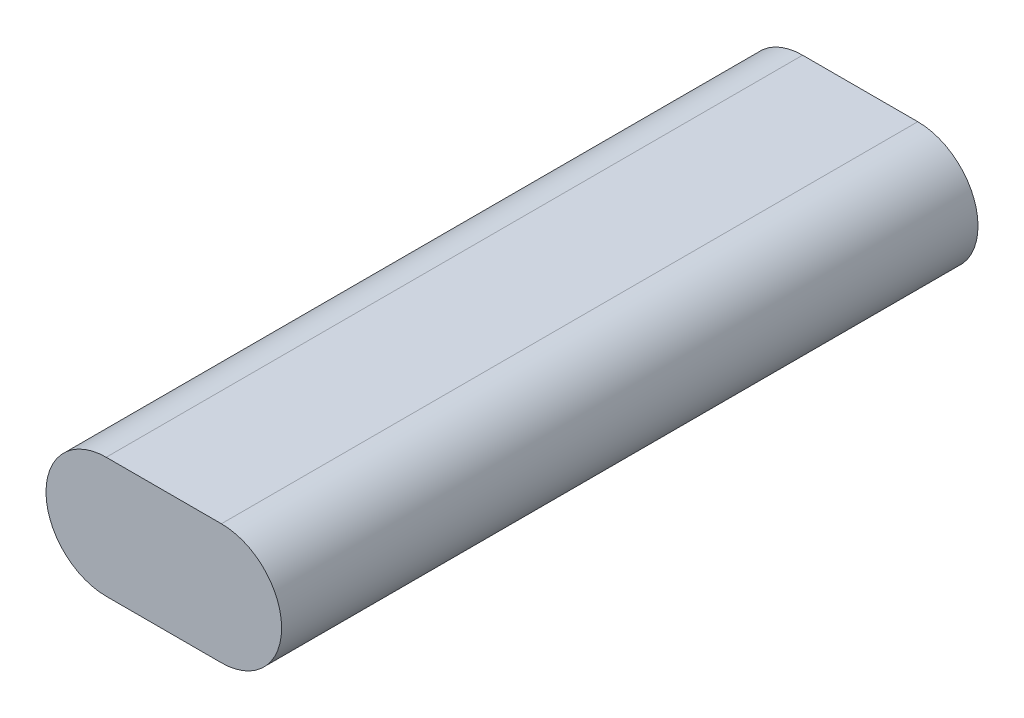
ISO-10303-21;
HEADER;
FILE_DESCRIPTION(('STEP AP214'),'2;1');
FILE_NAME('part.step','',(''),(''),'','','');
FILE_SCHEMA(('AUTOMOTIVE_DESIGN { 1 0 10303 214 1 1 1 1 }'));
ENDSEC;
DATA;
#1=APPLICATION_CONTEXT('core data for automotive mechanical design processes');
#2=APPLICATION_PROTOCOL_DEFINITION('international standard','automotive_design',2000,#1);
#3=PRODUCT_CONTEXT('',#1,'mechanical');
#4=PRODUCT('Part','Part','',(#3));
#5=PRODUCT_RELATED_PRODUCT_CATEGORY('part','',(#4));
#6=PRODUCT_DEFINITION_FORMATION('','',#4);
#7=PRODUCT_DEFINITION_CONTEXT('part definition',#1,'design');
#8=PRODUCT_DEFINITION('design','',#6,#7);
#9=PRODUCT_DEFINITION_SHAPE('','',#8);
#10=(LENGTH_UNIT() NAMED_UNIT(*) SI_UNIT(.MILLI.,.METRE.));
#11=(NAMED_UNIT(*) PLANE_ANGLE_UNIT() SI_UNIT($,.RADIAN.));
#12=(NAMED_UNIT(*) SI_UNIT($,.STERADIAN.) SOLID_ANGLE_UNIT());
#13=UNCERTAINTY_MEASURE_WITH_UNIT(LENGTH_MEASURE(1.E-05),#10,'distance_accuracy_value','');
#14=(GEOMETRIC_REPRESENTATION_CONTEXT(3) GLOBAL_UNCERTAINTY_ASSIGNED_CONTEXT((#13)) GLOBAL_UNIT_ASSIGNED_CONTEXT((#10,
#11,#12)) REPRESENTATION_CONTEXT('',''));
#15=CARTESIAN_POINT('',(0.,0.,0.));
#16=DIRECTION('',(0.,0.,1.));
#17=DIRECTION('',(1.,0.,0.));
#18=AXIS2_PLACEMENT_3D('',#15,#16,#17);
#19=CARTESIAN_POINT('',(0.,0.,-1.));
#20=DIRECTION('',(0.,0.,-1.));
#21=DIRECTION('',(-1.,0.,0.));
#22=AXIS2_PLACEMENT_3D('',#19,#20,#21);
#23=PLANE('',#22);
#24=CARTESIAN_POINT('',(0.,0.,-1.));
#25=DIRECTION('',(0.,0.,-1.));
#26=DIRECTION('',(-1.,0.,0.));
#27=AXIS2_PLACEMENT_3D('',#24,#25,#26);
#28=CIRCLE('',#27,5.);
#29=CARTESIAN_POINT('',(0.,-5.,-1.));
#30=VERTEX_POINT('',#29);
#31=CARTESIAN_POINT('',(0.,5.,-1.));
#32=VERTEX_POINT('',#31);
#33=EDGE_CURVE('E214',#30,#32,#28,.T.);
#34=ORIENTED_EDGE('',*,*,#33,.T.);
#35=DIRECTION('',(1.,0.,0.));
#36=VECTOR('',#35,1.);
#37=CARTESIAN_POINT('',(22.,5.,-1.));
#38=LINE('',#37,#36);
#39=CARTESIAN_POINT('',(22.,5.,-1.));
#40=VERTEX_POINT('',#39);
#41=EDGE_CURVE('E216',#32,#40,#38,.T.);
#42=ORIENTED_EDGE('',*,*,#41,.T.);
#43=CARTESIAN_POINT('',(22.,0.,-1.));
#44=DIRECTION('',(0.,0.,-1.));
#45=DIRECTION('',(-1.,0.,0.));
#46=AXIS2_PLACEMENT_3D('',#43,#44,#45);
#47=CIRCLE('',#46,5.);
#48=CARTESIAN_POINT('',(22.,-5.,-1.));
#49=VERTEX_POINT('',#48);
#50=EDGE_CURVE('E219',#40,#49,#47,.T.);
#51=ORIENTED_EDGE('',*,*,#50,.T.);
#52=DIRECTION('',(-1.,0.,0.));
#53=VECTOR('',#52,1.);
#54=CARTESIAN_POINT('',(22.,-5.,-1.));
#55=LINE('',#54,#53);
#56=EDGE_CURVE('E221',#49,#30,#55,.T.);
#57=ORIENTED_EDGE('',*,*,#56,.T.);
#58=EDGE_LOOP('',(#34,#42,#51,#57));
#59=FACE_BOUND('',#58,.T.);
#60=DIRECTION('',(-1.,0.,0.));
#61=VECTOR('',#60,1.);
#62=CARTESIAN_POINT('',(9.,-4.,-1.));
#63=LINE('',#62,#61);
#64=CARTESIAN_POINT('',(13.,-4.,-1.));
#65=VERTEX_POINT('',#64);
#66=CARTESIAN_POINT('',(9.,-4.,-1.));
#67=VERTEX_POINT('',#66);
#68=EDGE_CURVE('E200',#65,#67,#63,.T.);
#69=ORIENTED_EDGE('',*,*,#68,.F.);
#70=CARTESIAN_POINT('',(13.,0.,-1.));
#71=DIRECTION('',(0.,0.,-1.));
#72=DIRECTION('',(-1.,0.,0.));
#73=AXIS2_PLACEMENT_3D('',#70,#71,#72);
#74=CIRCLE('',#73,4.);
#75=CARTESIAN_POINT('',(13.,4.,-1.));
#76=VERTEX_POINT('',#75);
#77=EDGE_CURVE('E183',#76,#65,#74,.T.);
#78=ORIENTED_EDGE('',*,*,#77,.F.);
#79=DIRECTION('',(1.,0.,0.));
#80=VECTOR('',#79,1.);
#81=CARTESIAN_POINT('',(13.,4.,-1.));
#82=LINE('',#81,#80);
#83=CARTESIAN_POINT('',(9.,4.,-1.));
#84=VERTEX_POINT('',#83);
#85=EDGE_CURVE('E191',#84,#76,#82,.T.);
#86=ORIENTED_EDGE('',*,*,#85,.F.);
#87=CARTESIAN_POINT('',(9.,0.,-1.));
#88=DIRECTION('',(0.,0.,-1.));
#89=DIRECTION('',(-1.,0.,0.));
#90=AXIS2_PLACEMENT_3D('',#87,#88,#89);
#91=CIRCLE('',#90,4.);
#92=EDGE_CURVE('E202',#67,#84,#91,.T.);
#93=ORIENTED_EDGE('',*,*,#92,.F.);
#94=EDGE_LOOP('',(#69,#78,#86,#93));
#95=FACE_BOUND('',#94,.T.);
#96=ADVANCED_FACE('F32',(#59,#95),#23,.T.);
#97=CARTESIAN_POINT('',(0.,0.,0.));
#98=DIRECTION('',(0.,0.,1.));
#99=DIRECTION('',(1.,0.,0.));
#100=AXIS2_PLACEMENT_3D('',#97,#98,#99);
#101=PLANE('',#100);
#102=CARTESIAN_POINT('',(22.,0.,0.));
#103=DIRECTION('',(0.,0.,1.));
#104=DIRECTION('',(1.,0.,0.));
#105=AXIS2_PLACEMENT_3D('',#102,#103,#104);
#106=CIRCLE('',#105,6.);
#107=CARTESIAN_POINT('',(22.,-6.,0.));
#108=VERTEX_POINT('',#107);
#109=CARTESIAN_POINT('',(22.,6.,0.));
#110=VERTEX_POINT('',#109);
#111=EDGE_CURVE('E255',#108,#110,#106,.T.);
#112=ORIENTED_EDGE('',*,*,#111,.T.);
#113=DIRECTION('',(-1.,0.,0.));
#114=VECTOR('',#113,1.);
#115=CARTESIAN_POINT('',(0.,6.,0.));
#116=LINE('',#115,#114);
#117=CARTESIAN_POINT('',(0.,6.,0.));
#118=VERTEX_POINT('',#117);
#119=EDGE_CURVE('E11',#110,#118,#116,.T.);
#120=ORIENTED_EDGE('',*,*,#119,.T.);
#121=CARTESIAN_POINT('',(0.,0.,0.));
#122=DIRECTION('',(0.,0.,1.));
#123=DIRECTION('',(1.,0.,0.));
#124=AXIS2_PLACEMENT_3D('',#121,#122,#123);
#125=CIRCLE('',#124,6.);
#126=CARTESIAN_POINT('',(0.,-6.,0.));
#127=VERTEX_POINT('',#126);
#128=EDGE_CURVE('E41',#118,#127,#125,.T.);
#129=ORIENTED_EDGE('',*,*,#128,.T.);
#130=DIRECTION('',(1.,0.,0.));
#131=VECTOR('',#130,1.);
#132=CARTESIAN_POINT('',(22.,-6.,0.));
#133=LINE('',#132,#131);
#134=EDGE_CURVE('E253',#127,#108,#133,.T.);
#135=ORIENTED_EDGE('',*,*,#134,.T.);
#136=EDGE_LOOP('',(#112,#120,#129,#135));
#137=FACE_BOUND('',#136,.T.);
#138=CARTESIAN_POINT('',(0.,0.,0.));
#139=DIRECTION('',(0.,0.,1.));
#140=DIRECTION('',(1.,0.,0.));
#141=AXIS2_PLACEMENT_3D('',#138,#139,#140);
#142=CIRCLE('',#141,11.5);
#143=CARTESIAN_POINT('',(0.,11.5,0.));
#144=VERTEX_POINT('',#143);
#145=CARTESIAN_POINT('',(0.,-11.5,0.));
#146=VERTEX_POINT('',#145);
#147=EDGE_CURVE('E223',#144,#146,#142,.T.);
#148=ORIENTED_EDGE('',*,*,#147,.F.);
#149=DIRECTION('',(-1.,0.,0.));
#150=VECTOR('',#149,1.);
#151=CARTESIAN_POINT('',(0.,11.5,0.));
#152=LINE('',#151,#150);
#153=CARTESIAN_POINT('',(22.,11.5,0.));
#154=VERTEX_POINT('',#153);
#155=EDGE_CURVE('E228',#154,#144,#152,.T.);
#156=ORIENTED_EDGE('',*,*,#155,.F.);
#157=CARTESIAN_POINT('',(22.,0.,0.));
#158=DIRECTION('',(0.,0.,1.));
#159=DIRECTION('',(1.,0.,0.));
#160=AXIS2_PLACEMENT_3D('',#157,#158,#159);
#161=CIRCLE('',#160,11.5);
#162=CARTESIAN_POINT('',(22.,-11.5,0.));
#163=VERTEX_POINT('',#162);
#164=EDGE_CURVE('E239',#163,#154,#161,.T.);
#165=ORIENTED_EDGE('',*,*,#164,.F.);
#166=DIRECTION('',(1.,0.,0.));
#167=VECTOR('',#166,1.);
#168=CARTESIAN_POINT('',(0.,-11.5,0.));
#169=LINE('',#168,#167);
#170=EDGE_CURVE('E237',#146,#163,#169,.T.);
#171=ORIENTED_EDGE('',*,*,#170,.F.);
#172=EDGE_LOOP('',(#148,#156,#165,#171));
#173=FACE_BOUND('',#172,.T.);
#174=ADVANCED_FACE('F277',(#137,#173),#101,.F.);
#175=CARTESIAN_POINT('',(0.,0.,133.));
#176=DIRECTION('',(0.,0.,-1.));
#177=DIRECTION('',(-1.,0.,0.));
#178=AXIS2_PLACEMENT_3D('',#175,#176,#177);
#179=CYLINDRICAL_SURFACE('',#178,11.5);
#180=ORIENTED_EDGE('',*,*,#147,.T.);
#181=DIRECTION('',(0.,0.,-1.));
#182=VECTOR('',#181,1.);
#183=CARTESIAN_POINT('',(0.,-11.5,133.));
#184=LINE('',#183,#182);
#185=CARTESIAN_POINT('',(0.,-11.5,133.));
#186=VERTEX_POINT('',#185);
#187=EDGE_CURVE('E250',#186,#146,#184,.T.);
#188=ORIENTED_EDGE('',*,*,#187,.F.);
#189=CARTESIAN_POINT('',(0.,0.,133.));
#190=DIRECTION('',(0.,0.,1.));
#191=DIRECTION('',(1.,0.,0.));
#192=AXIS2_PLACEMENT_3D('',#189,#190,#191);
#193=CIRCLE('',#192,11.5);
#194=CARTESIAN_POINT('',(0.,11.5,133.));
#195=VERTEX_POINT('',#194);
#196=EDGE_CURVE('E224',#195,#186,#193,.T.);
#197=ORIENTED_EDGE('',*,*,#196,.F.);
#198=DIRECTION('',(0.,0.,-1.));
#199=VECTOR('',#198,1.);
#200=CARTESIAN_POINT('',(0.,11.5,133.));
#201=LINE('',#200,#199);
#202=EDGE_CURVE('E234',#195,#144,#201,.T.);
#203=ORIENTED_EDGE('',*,*,#202,.T.);
#204=EDGE_LOOP('',(#180,#188,#197,#203));
#205=FACE_BOUND('',#204,.T.);
#206=ADVANCED_FACE('F329',(#205),#179,.T.);
#207=CARTESIAN_POINT('',(0.,-11.5,133.));
#208=DIRECTION('',(0.,1.,0.));
#209=DIRECTION('',(0.,0.,1.));
#210=AXIS2_PLACEMENT_3D('',#207,#208,#209);
#211=PLANE('',#210);
#212=ORIENTED_EDGE('',*,*,#170,.T.);
#213=DIRECTION('',(0.,0.,-1.));
#214=VECTOR('',#213,1.);
#215=CARTESIAN_POINT('',(22.,-11.5,133.));
#216=LINE('',#215,#214);
#217=CARTESIAN_POINT('',(22.,-11.5,133.));
#218=VERTEX_POINT('',#217);
#219=EDGE_CURVE('E247',#218,#163,#216,.T.);
#220=ORIENTED_EDGE('',*,*,#219,.F.);
#221=DIRECTION('',(1.,0.,0.));
#222=VECTOR('',#221,1.);
#223=CARTESIAN_POINT('',(0.,-11.5,133.));
#224=LINE('',#223,#222);
#225=EDGE_CURVE('E227',#186,#218,#224,.T.);
#226=ORIENTED_EDGE('',*,*,#225,.F.);
#227=ORIENTED_EDGE('',*,*,#187,.T.);
#228=EDGE_LOOP('',(#212,#220,#226,#227));
#229=FACE_BOUND('',#228,.T.);
#230=ADVANCED_FACE('F336',(#229),#211,.F.);
#231=CARTESIAN_POINT('',(22.,0.,133.));
#232=DIRECTION('',(0.,0.,-1.));
#233=DIRECTION('',(-1.,0.,0.));
#234=AXIS2_PLACEMENT_3D('',#231,#232,#233);
#235=CYLINDRICAL_SURFACE('',#234,11.5);
#236=ORIENTED_EDGE('',*,*,#164,.T.);
#237=DIRECTION('',(0.,0.,-1.));
#238=VECTOR('',#237,1.);
#239=CARTESIAN_POINT('',(22.,11.5,133.));
#240=LINE('',#239,#238);
#241=CARTESIAN_POINT('',(22.,11.5,133.));
#242=VERTEX_POINT('',#241);
#243=EDGE_CURVE('E244',#242,#154,#240,.T.);
#244=ORIENTED_EDGE('',*,*,#243,.F.);
#245=CARTESIAN_POINT('',(22.,0.,133.));
#246=DIRECTION('',(0.,0.,1.));
#247=DIRECTION('',(1.,0.,0.));
#248=AXIS2_PLACEMENT_3D('',#245,#246,#247);
#249=CIRCLE('',#248,11.5);
#250=EDGE_CURVE('E230',#218,#242,#249,.T.);
#251=ORIENTED_EDGE('',*,*,#250,.F.);
#252=ORIENTED_EDGE('',*,*,#219,.T.);
#253=EDGE_LOOP('',(#236,#244,#251,#252));
#254=FACE_BOUND('',#253,.T.);
#255=ADVANCED_FACE('F332',(#254),#235,.T.);
#256=CARTESIAN_POINT('',(0.,11.5,133.));
#257=DIRECTION('',(0.,-1.,0.));
#258=DIRECTION('',(0.,0.,-1.));
#259=AXIS2_PLACEMENT_3D('',#256,#257,#258);
#260=PLANE('',#259);
#261=ORIENTED_EDGE('',*,*,#155,.T.);
#262=ORIENTED_EDGE('',*,*,#202,.F.);
#263=DIRECTION('',(-1.,0.,0.));
#264=VECTOR('',#263,1.);
#265=CARTESIAN_POINT('',(0.,11.5,133.));
#266=LINE('',#265,#264);
#267=EDGE_CURVE('E232',#242,#195,#266,.T.);
#268=ORIENTED_EDGE('',*,*,#267,.F.);
#269=ORIENTED_EDGE('',*,*,#243,.T.);
#270=EDGE_LOOP('',(#261,#262,#268,#269));
#271=FACE_BOUND('',#270,.T.);
#272=ADVANCED_FACE('F325',(#271),#260,.F.);
#273=CARTESIAN_POINT('',(0.,0.,133.));
#274=DIRECTION('',(0.,0.,1.));
#275=DIRECTION('',(1.,0.,0.));
#276=AXIS2_PLACEMENT_3D('',#273,#274,#275);
#277=PLANE('',#276);
#278=ORIENTED_EDGE('',*,*,#196,.T.);
#279=ORIENTED_EDGE('',*,*,#225,.T.);
#280=ORIENTED_EDGE('',*,*,#250,.T.);
#281=ORIENTED_EDGE('',*,*,#267,.T.);
#282=EDGE_LOOP('',(#278,#279,#280,#281));
#283=FACE_BOUND('',#282,.T.);
#284=ADVANCED_FACE('F322',(#283),#277,.T.);
#285=CARTESIAN_POINT('',(22.,-5.,-1.));
#286=DIRECTION('',(0.,-0.707106781186547,-0.707106781186547));
#287=DIRECTION('',(0.,0.707106781186548,-0.707106781186548));
#288=AXIS2_PLACEMENT_3D('',#285,#286,#287);
#289=PLANE('',#288);
#290=DIRECTION('',(0.,0.707106781186547,-0.707106781186547));
#291=VECTOR('',#290,1.);
#292=CARTESIAN_POINT('',(22.,-6.,0.));
#293=LINE('',#292,#291);
#294=EDGE_CURVE('E260',#108,#49,#293,.T.);
#295=ORIENTED_EDGE('',*,*,#294,.F.);
#296=ORIENTED_EDGE('',*,*,#134,.F.);
#297=DIRECTION('',(0.,-0.707106781186547,0.707106781186547));
#298=VECTOR('',#297,1.);
#299=CARTESIAN_POINT('',(0.,-5.,-1.));
#300=LINE('',#299,#298);
#301=EDGE_CURVE('E36',#30,#127,#300,.T.);
#302=ORIENTED_EDGE('',*,*,#301,.F.);
#303=ORIENTED_EDGE('',*,*,#56,.F.);
#304=EDGE_LOOP('',(#295,#296,#302,#303));
#305=FACE_BOUND('',#304,.T.);
#306=ADVANCED_FACE('F34',(#305),#289,.T.);
#307=CARTESIAN_POINT('',(0.,0.,-1.));
#308=DIRECTION('',(0.,0.,1.));
#309=DIRECTION('',(1.,0.,0.));
#310=AXIS2_PLACEMENT_3D('',#307,#308,#309);
#311=CONICAL_SURFACE('',#310,5.,0.785398163397448);
#312=ORIENTED_EDGE('',*,*,#301,.T.);
#313=ORIENTED_EDGE('',*,*,#128,.F.);
#314=DIRECTION('',(0.,0.707106781186547,0.707106781186547));
#315=VECTOR('',#314,1.);
#316=CARTESIAN_POINT('',(0.,5.,-1.));
#317=LINE('',#316,#315);
#318=EDGE_CURVE('E259',#32,#118,#317,.T.);
#319=ORIENTED_EDGE('',*,*,#318,.F.);
#320=ORIENTED_EDGE('',*,*,#33,.F.);
#321=EDGE_LOOP('',(#312,#313,#319,#320));
#322=FACE_BOUND('',#321,.T.);
#323=ADVANCED_FACE('F271',(#322),#311,.T.);
#324=CARTESIAN_POINT('',(22.,0.,-1.));
#325=DIRECTION('',(0.,0.,1.));
#326=DIRECTION('',(1.,0.,0.));
#327=AXIS2_PLACEMENT_3D('',#324,#325,#326);
#328=CONICAL_SURFACE('',#327,5.,0.785398163397448);
#329=ORIENTED_EDGE('',*,*,#294,.T.);
#330=ORIENTED_EDGE('',*,*,#50,.F.);
#331=DIRECTION('',(0.,-0.707106781186547,-0.707106781186547));
#332=VECTOR('',#331,1.);
#333=CARTESIAN_POINT('',(22.,6.,0.));
#334=LINE('',#333,#332);
#335=EDGE_CURVE('E213',#110,#40,#334,.T.);
#336=ORIENTED_EDGE('',*,*,#335,.F.);
#337=ORIENTED_EDGE('',*,*,#111,.F.);
#338=EDGE_LOOP('',(#329,#330,#336,#337));
#339=FACE_BOUND('',#338,.T.);
#340=ADVANCED_FACE('F284',(#339),#328,.T.);
#341=CARTESIAN_POINT('',(22.,5.,-1.));
#342=DIRECTION('',(0.,0.707106781186547,-0.707106781186547));
#343=DIRECTION('',(0.,0.707106781186548,0.707106781186548));
#344=AXIS2_PLACEMENT_3D('',#341,#342,#343);
#345=PLANE('',#344);
#346=ORIENTED_EDGE('',*,*,#318,.T.);
#347=ORIENTED_EDGE('',*,*,#119,.F.);
#348=ORIENTED_EDGE('',*,*,#335,.T.);
#349=ORIENTED_EDGE('',*,*,#41,.F.);
#350=EDGE_LOOP('',(#346,#347,#348,#349));
#351=FACE_BOUND('',#350,.T.);
#352=ADVANCED_FACE('F282',(#351),#345,.T.);
#353=CARTESIAN_POINT('',(13.,0.,-4.));
#354=DIRECTION('',(0.,0.,1.));
#355=DIRECTION('',(1.,0.,0.));
#356=AXIS2_PLACEMENT_3D('',#353,#354,#355);
#357=CYLINDRICAL_SURFACE('',#356,4.);
#358=ORIENTED_EDGE('',*,*,#77,.T.);
#359=DIRECTION('',(0.,0.,1.));
#360=VECTOR('',#359,1.);
#361=CARTESIAN_POINT('',(13.,-4.,-4.));
#362=LINE('',#361,#360);
#363=CARTESIAN_POINT('',(13.,-4.,-4.));
#364=VERTEX_POINT('',#363);
#365=EDGE_CURVE('E211',#364,#65,#362,.T.);
#366=ORIENTED_EDGE('',*,*,#365,.F.);
#367=CARTESIAN_POINT('',(13.,0.,-4.));
#368=DIRECTION('',(0.,0.,-1.));
#369=DIRECTION('',(-1.,0.,0.));
#370=AXIS2_PLACEMENT_3D('',#367,#368,#369);
#371=CIRCLE('',#370,4.);
#372=CARTESIAN_POINT('',(13.,4.,-4.));
#373=VERTEX_POINT('',#372);
#374=EDGE_CURVE('E187',#373,#364,#371,.T.);
#375=ORIENTED_EDGE('',*,*,#374,.F.);
#376=DIRECTION('',(0.,0.,1.));
#377=VECTOR('',#376,1.);
#378=CARTESIAN_POINT('',(13.,4.,-4.));
#379=LINE('',#378,#377);
#380=EDGE_CURVE('E197',#373,#76,#379,.T.);
#381=ORIENTED_EDGE('',*,*,#380,.T.);
#382=EDGE_LOOP('',(#358,#366,#375,#381));
#383=FACE_BOUND('',#382,.T.);
#384=ADVANCED_FACE('F305',(#383),#357,.T.);
#385=CARTESIAN_POINT('',(9.,-4.,-4.));
#386=DIRECTION('',(0.,1.,0.));
#387=DIRECTION('',(-1.,0.,0.));
#388=AXIS2_PLACEMENT_3D('',#385,#386,#387);
#389=PLANE('',#388);
#390=ORIENTED_EDGE('',*,*,#68,.T.);
#391=DIRECTION('',(0.,0.,1.));
#392=VECTOR('',#391,1.);
#393=CARTESIAN_POINT('',(9.,-4.,-4.));
#394=LINE('',#393,#392);
#395=CARTESIAN_POINT('',(9.,-4.,-4.));
#396=VERTEX_POINT('',#395);
#397=EDGE_CURVE('E208',#396,#67,#394,.T.);
#398=ORIENTED_EDGE('',*,*,#397,.F.);
#399=DIRECTION('',(-1.,0.,0.));
#400=VECTOR('',#399,1.);
#401=CARTESIAN_POINT('',(9.,-4.,-4.));
#402=LINE('',#401,#400);
#403=EDGE_CURVE('E190',#364,#396,#402,.T.);
#404=ORIENTED_EDGE('',*,*,#403,.F.);
#405=ORIENTED_EDGE('',*,*,#365,.T.);
#406=EDGE_LOOP('',(#390,#398,#404,#405));
#407=FACE_BOUND('',#406,.T.);
#408=ADVANCED_FACE('F295',(#407),#389,.F.);
#409=CARTESIAN_POINT('',(9.,0.,-4.));
#410=DIRECTION('',(0.,0.,1.));
#411=DIRECTION('',(1.,0.,0.));
#412=AXIS2_PLACEMENT_3D('',#409,#410,#411);
#413=CYLINDRICAL_SURFACE('',#412,4.);
#414=ORIENTED_EDGE('',*,*,#92,.T.);
#415=DIRECTION('',(0.,0.,1.));
#416=VECTOR('',#415,1.);
#417=CARTESIAN_POINT('',(9.,4.,-4.));
#418=LINE('',#417,#416);
#419=CARTESIAN_POINT('',(9.,4.,-4.));
#420=VERTEX_POINT('',#419);
#421=EDGE_CURVE('E57',#420,#84,#418,.T.);
#422=ORIENTED_EDGE('',*,*,#421,.F.);
#423=CARTESIAN_POINT('',(9.,0.,-4.));
#424=DIRECTION('',(0.,0.,-1.));
#425=DIRECTION('',(-1.,0.,0.));
#426=AXIS2_PLACEMENT_3D('',#423,#424,#425);
#427=CIRCLE('',#426,4.);
#428=EDGE_CURVE('E193',#396,#420,#427,.T.);
#429=ORIENTED_EDGE('',*,*,#428,.F.);
#430=ORIENTED_EDGE('',*,*,#397,.T.);
#431=EDGE_LOOP('',(#414,#422,#429,#430));
#432=FACE_BOUND('',#431,.T.);
#433=ADVANCED_FACE('F299',(#432),#413,.T.);
#434=CARTESIAN_POINT('',(13.,4.,-4.));
#435=DIRECTION('',(0.,-1.,0.));
#436=DIRECTION('',(1.,0.,0.));
#437=AXIS2_PLACEMENT_3D('',#434,#435,#436);
#438=PLANE('',#437);
#439=ORIENTED_EDGE('',*,*,#85,.T.);
#440=ORIENTED_EDGE('',*,*,#380,.F.);
#441=DIRECTION('',(1.,0.,0.));
#442=VECTOR('',#441,1.);
#443=CARTESIAN_POINT('',(13.,4.,-4.));
#444=LINE('',#443,#442);
#445=EDGE_CURVE('E195',#420,#373,#444,.T.);
#446=ORIENTED_EDGE('',*,*,#445,.F.);
#447=ORIENTED_EDGE('',*,*,#421,.T.);
#448=EDGE_LOOP('',(#439,#440,#446,#447));
#449=FACE_BOUND('',#448,.T.);
#450=ADVANCED_FACE('F306',(#449),#438,.F.);
#451=CARTESIAN_POINT('',(13.,0.,-4.));
#452=DIRECTION('',(0.,0.,-1.));
#453=DIRECTION('',(-1.,0.,0.));
#454=AXIS2_PLACEMENT_3D('',#451,#452,#453);
#455=PLANE('',#454);
#456=CARTESIAN_POINT('',(9.,0.,-4.));
#457=DIRECTION('',(0.,0.,-1.));
#458=DIRECTION('',(-1.,0.,0.));
#459=AXIS2_PLACEMENT_3D('',#456,#457,#458);
#460=CIRCLE('',#459,2.5);
#461=CARTESIAN_POINT('',(9.,-2.5,-4.));
#462=VERTEX_POINT('',#461);
#463=CARTESIAN_POINT('',(9.,2.5,-4.));
#464=VERTEX_POINT('',#463);
#465=EDGE_CURVE('E49',#462,#464,#460,.T.);
#466=ORIENTED_EDGE('',*,*,#465,.F.);
#467=DIRECTION('',(-1.,0.,0.));
#468=VECTOR('',#467,1.);
#469=CARTESIAN_POINT('',(9.,-2.5,-4.));
#470=LINE('',#469,#468);
#471=CARTESIAN_POINT('',(13.,-2.5,-4.));
#472=VERTEX_POINT('',#471);
#473=EDGE_CURVE('E168',#472,#462,#470,.T.);
#474=ORIENTED_EDGE('',*,*,#473,.F.);
#475=CARTESIAN_POINT('',(13.,0.,-4.));
#476=DIRECTION('',(0.,0.,-1.));
#477=DIRECTION('',(-1.,0.,0.));
#478=AXIS2_PLACEMENT_3D('',#475,#476,#477);
#479=CIRCLE('',#478,2.5);
#480=CARTESIAN_POINT('',(13.,2.5,-4.));
#481=VERTEX_POINT('',#480);
#482=EDGE_CURVE('E171',#481,#472,#479,.T.);
#483=ORIENTED_EDGE('',*,*,#482,.F.);
#484=DIRECTION('',(1.,0.,0.));
#485=VECTOR('',#484,1.);
#486=CARTESIAN_POINT('',(13.,2.5,-4.));
#487=LINE('',#486,#485);
#488=EDGE_CURVE('E177',#464,#481,#487,.T.);
#489=ORIENTED_EDGE('',*,*,#488,.F.);
#490=EDGE_LOOP('',(#466,#474,#483,#489));
#491=FACE_BOUND('',#490,.T.);
#492=ORIENTED_EDGE('',*,*,#374,.T.);
#493=ORIENTED_EDGE('',*,*,#403,.T.);
#494=ORIENTED_EDGE('',*,*,#428,.T.);
#495=ORIENTED_EDGE('',*,*,#445,.T.);
#496=EDGE_LOOP('',(#492,#493,#494,#495));
#497=FACE_BOUND('',#496,.T.);
#498=ADVANCED_FACE('F301',(#491,#497),#455,.T.);
#499=CARTESIAN_POINT('',(9.,0.,6.));
#500=DIRECTION('',(0.,0.,-1.));
#501=DIRECTION('',(-1.,0.,0.));
#502=AXIS2_PLACEMENT_3D('',#499,#500,#501);
#503=CYLINDRICAL_SURFACE('',#502,2.5);
#504=ORIENTED_EDGE('',*,*,#465,.T.);
#505=DIRECTION('',(0.,0.,-1.));
#506=VECTOR('',#505,1.);
#507=CARTESIAN_POINT('',(9.,2.5,6.));
#508=LINE('',#507,#506);
#509=CARTESIAN_POINT('',(9.,2.5,6.));
#510=VERTEX_POINT('',#509);
#511=EDGE_CURVE('E146',#510,#464,#508,.T.);
#512=ORIENTED_EDGE('',*,*,#511,.F.);
#513=CARTESIAN_POINT('',(9.,0.,6.));
#514=DIRECTION('',(0.,0.,-1.));
#515=DIRECTION('',(-1.,0.,0.));
#516=AXIS2_PLACEMENT_3D('',#513,#514,#515);
#517=CIRCLE('',#516,2.5);
#518=CARTESIAN_POINT('',(9.,-2.5,6.));
#519=VERTEX_POINT('',#518);
#520=EDGE_CURVE('E150',#519,#510,#517,.T.);
#521=ORIENTED_EDGE('',*,*,#520,.F.);
#522=DIRECTION('',(0.,0.,-1.));
#523=VECTOR('',#522,1.);
#524=CARTESIAN_POINT('',(9.,-2.5,6.));
#525=LINE('',#524,#523);
#526=EDGE_CURVE('E181',#519,#462,#525,.T.);
#527=ORIENTED_EDGE('',*,*,#526,.T.);
#528=EDGE_LOOP('',(#504,#512,#521,#527));
#529=FACE_BOUND('',#528,.T.);
#530=ADVANCED_FACE('F148',(#529),#503,.F.);
#531=CARTESIAN_POINT('',(9.,-2.5,6.));
#532=DIRECTION('',(0.,-1.,0.));
#533=DIRECTION('',(0.,0.,-1.));
#534=AXIS2_PLACEMENT_3D('',#531,#532,#533);
#535=PLANE('',#534);
#536=ORIENTED_EDGE('',*,*,#473,.T.);
#537=ORIENTED_EDGE('',*,*,#526,.F.);
#538=DIRECTION('',(-1.,0.,0.));
#539=VECTOR('',#538,1.);
#540=CARTESIAN_POINT('',(9.,-2.5,6.));
#541=LINE('',#540,#539);
#542=CARTESIAN_POINT('',(13.,-2.5,6.));
#543=VERTEX_POINT('',#542);
#544=EDGE_CURVE('E156',#543,#519,#541,.T.);
#545=ORIENTED_EDGE('',*,*,#544,.F.);
#546=DIRECTION('',(0.,0.,-1.));
#547=VECTOR('',#546,1.);
#548=CARTESIAN_POINT('',(13.,-2.5,6.));
#549=LINE('',#548,#547);
#550=EDGE_CURVE('E184',#543,#472,#549,.T.);
#551=ORIENTED_EDGE('',*,*,#550,.T.);
#552=EDGE_LOOP('',(#536,#537,#545,#551));
#553=FACE_BOUND('',#552,.T.);
#554=ADVANCED_FACE('F422',(#553),#535,.F.);
#555=CARTESIAN_POINT('',(13.,0.,6.));
#556=DIRECTION('',(0.,0.,-1.));
#557=DIRECTION('',(-1.,0.,0.));
#558=AXIS2_PLACEMENT_3D('',#555,#556,#557);
#559=CYLINDRICAL_SURFACE('',#558,2.5);
#560=ORIENTED_EDGE('',*,*,#482,.T.);
#561=ORIENTED_EDGE('',*,*,#550,.F.);
#562=CARTESIAN_POINT('',(13.,0.,6.));
#563=DIRECTION('',(0.,0.,-1.));
#564=DIRECTION('',(-1.,0.,0.));
#565=AXIS2_PLACEMENT_3D('',#562,#563,#564);
#566=CIRCLE('',#565,2.5);
#567=CARTESIAN_POINT('',(13.,2.5,6.));
#568=VERTEX_POINT('',#567);
#569=EDGE_CURVE('E164',#568,#543,#566,.T.);
#570=ORIENTED_EDGE('',*,*,#569,.F.);
#571=DIRECTION('',(0.,0.,-1.));
#572=VECTOR('',#571,1.);
#573=CARTESIAN_POINT('',(13.,2.5,6.));
#574=LINE('',#573,#572);
#575=EDGE_CURVE('E155',#568,#481,#574,.T.);
#576=ORIENTED_EDGE('',*,*,#575,.T.);
#577=EDGE_LOOP('',(#560,#561,#570,#576));
#578=FACE_BOUND('',#577,.T.);
#579=ADVANCED_FACE('F430',(#578),#559,.F.);
#580=CARTESIAN_POINT('',(13.,2.5,6.));
#581=DIRECTION('',(0.,1.,0.));
#582=DIRECTION('',(-1.,0.,0.));
#583=AXIS2_PLACEMENT_3D('',#580,#581,#582);
#584=PLANE('',#583);
#585=ORIENTED_EDGE('',*,*,#488,.T.);
#586=ORIENTED_EDGE('',*,*,#575,.F.);
#587=DIRECTION('',(1.,0.,0.));
#588=VECTOR('',#587,1.);
#589=CARTESIAN_POINT('',(13.,2.5,6.));
#590=LINE('',#589,#588);
#591=EDGE_CURVE('E159',#510,#568,#590,.T.);
#592=ORIENTED_EDGE('',*,*,#591,.F.);
#593=ORIENTED_EDGE('',*,*,#511,.T.);
#594=EDGE_LOOP('',(#585,#586,#592,#593));
#595=FACE_BOUND('',#594,.T.);
#596=ADVANCED_FACE('F160',(#595),#584,.F.);
#597=CARTESIAN_POINT('',(9.,0.,6.));
#598=DIRECTION('',(0.,0.,-1.));
#599=DIRECTION('',(-1.,0.,0.));
#600=AXIS2_PLACEMENT_3D('',#597,#598,#599);
#601=PLANE('',#600);
#602=ORIENTED_EDGE('',*,*,#520,.T.);
#603=ORIENTED_EDGE('',*,*,#591,.T.);
#604=ORIENTED_EDGE('',*,*,#569,.T.);
#605=ORIENTED_EDGE('',*,*,#544,.T.);
#606=EDGE_LOOP('',(#602,#603,#604,#605));
#607=FACE_BOUND('',#606,.T.);
#608=ADVANCED_FACE('F166',(#607),#601,.T.);
#609=CLOSED_SHELL('',(#96,#174,#206,#230,#255,#272,#284,#306,#323,#340,#352,#384,#408,#433,#450,
#498,#530,#554,#579,#596,#608));
#610=MANIFOLD_SOLID_BREP('B2',#609);
#611=ADVANCED_BREP_SHAPE_REPRESENTATION('',(#18,#610),#14);
#612=SHAPE_DEFINITION_REPRESENTATION(#9,#611);
ENDSEC;
END-ISO-10303-21;
